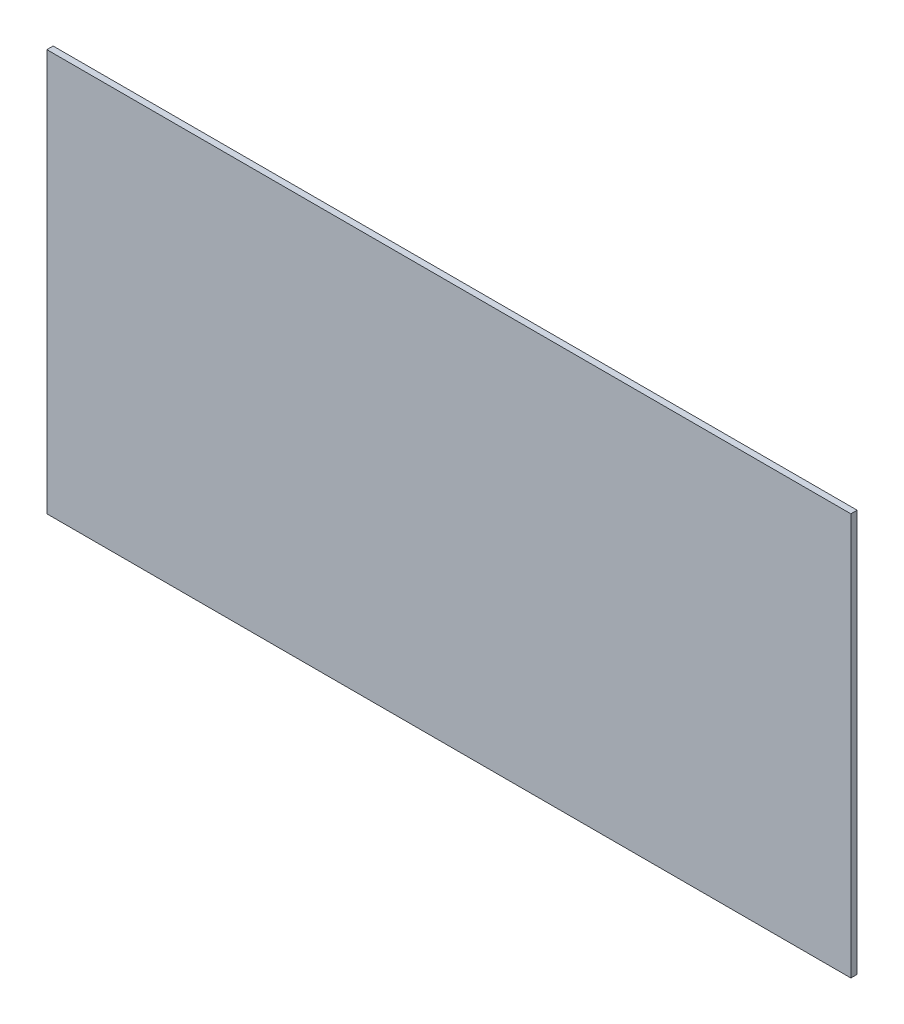
ISO-10303-21;
HEADER;
FILE_DESCRIPTION(('STEP AP214'),'2;1');
FILE_NAME('part.step','',(''),(''),'','','');
FILE_SCHEMA(('AUTOMOTIVE_DESIGN { 1 0 10303 214 1 1 1 1 }'));
ENDSEC;
DATA;
#1=APPLICATION_CONTEXT('core data for automotive mechanical design processes');
#2=APPLICATION_PROTOCOL_DEFINITION('international standard','automotive_design',2000,#1);
#3=PRODUCT_CONTEXT('',#1,'mechanical');
#4=PRODUCT('Part','Part','',(#3));
#5=PRODUCT_RELATED_PRODUCT_CATEGORY('part','',(#4));
#6=PRODUCT_DEFINITION_FORMATION('','',#4);
#7=PRODUCT_DEFINITION_CONTEXT('part definition',#1,'design');
#8=PRODUCT_DEFINITION('design','',#6,#7);
#9=PRODUCT_DEFINITION_SHAPE('','',#8);
#10=(LENGTH_UNIT() NAMED_UNIT(*) SI_UNIT(.MILLI.,.METRE.));
#11=(NAMED_UNIT(*) PLANE_ANGLE_UNIT() SI_UNIT($,.RADIAN.));
#12=(NAMED_UNIT(*) SI_UNIT($,.STERADIAN.) SOLID_ANGLE_UNIT());
#13=UNCERTAINTY_MEASURE_WITH_UNIT(LENGTH_MEASURE(1.E-05),#10,'distance_accuracy_value','');
#14=(GEOMETRIC_REPRESENTATION_CONTEXT(3) GLOBAL_UNCERTAINTY_ASSIGNED_CONTEXT((#13)) GLOBAL_UNIT_ASSIGNED_CONTEXT((#10,
#11,#12)) REPRESENTATION_CONTEXT('',''));
#15=CARTESIAN_POINT('',(0.,0.,0.));
#16=DIRECTION('',(0.,0.,1.));
#17=DIRECTION('',(1.,0.,0.));
#18=AXIS2_PLACEMENT_3D('',#15,#16,#17);
#19=CARTESIAN_POINT('',(-304.8,-152.4,2.38125));
#20=DIRECTION('',(0.,1.,0.));
#21=DIRECTION('',(0.,0.,1.));
#22=AXIS2_PLACEMENT_3D('',#19,#20,#21);
#23=PLANE('',#22);
#24=DIRECTION('',(1.,0.,0.));
#25=VECTOR('',#24,1.);
#26=CARTESIAN_POINT('',(-304.8,-152.4,-2.38125));
#27=LINE('',#26,#25);
#28=CARTESIAN_POINT('',(-304.8,-152.4,-2.38125));
#29=VERTEX_POINT('',#28);
#30=CARTESIAN_POINT('',(304.8,-152.4,-2.38125));
#31=VERTEX_POINT('',#30);
#32=EDGE_CURVE('E109',#29,#31,#27,.T.);
#33=ORIENTED_EDGE('',*,*,#32,.T.);
#34=DIRECTION('',(0.,0.,-1.));
#35=VECTOR('',#34,1.);
#36=CARTESIAN_POINT('',(304.8,-152.4,2.38125));
#37=LINE('',#36,#35);
#38=CARTESIAN_POINT('',(304.8,-152.4,2.38125));
#39=VERTEX_POINT('',#38);
#40=EDGE_CURVE('E11',#39,#31,#37,.T.);
#41=ORIENTED_EDGE('',*,*,#40,.F.);
#42=DIRECTION('',(1.,0.,0.));
#43=VECTOR('',#42,1.);
#44=CARTESIAN_POINT('',(-304.8,-152.4,2.38125));
#45=LINE('',#44,#43);
#46=CARTESIAN_POINT('',(-304.8,-152.4,2.38125));
#47=VERTEX_POINT('',#46);
#48=EDGE_CURVE('E93',#47,#39,#45,.T.);
#49=ORIENTED_EDGE('',*,*,#48,.F.);
#50=DIRECTION('',(0.,0.,-1.));
#51=VECTOR('',#50,1.);
#52=CARTESIAN_POINT('',(-304.8,-152.4,2.38125));
#53=LINE('',#52,#51);
#54=EDGE_CURVE('E105',#47,#29,#53,.T.);
#55=ORIENTED_EDGE('',*,*,#54,.T.);
#56=EDGE_LOOP('',(#33,#41,#49,#55));
#57=FACE_BOUND('',#56,.T.);
#58=ADVANCED_FACE('F41',(#57),#23,.F.);
#59=CARTESIAN_POINT('',(304.8,-152.4,2.38125));
#60=DIRECTION('',(-1.,0.,0.));
#61=DIRECTION('',(0.,0.,1.));
#62=AXIS2_PLACEMENT_3D('',#59,#60,#61);
#63=PLANE('',#62);
#64=DIRECTION('',(0.,1.,0.));
#65=VECTOR('',#64,1.);
#66=CARTESIAN_POINT('',(304.8,-152.4,-2.38125));
#67=LINE('',#66,#65);
#68=CARTESIAN_POINT('',(304.8,152.4,-2.38125));
#69=VERTEX_POINT('',#68);
#70=EDGE_CURVE('E98',#31,#69,#67,.T.);
#71=ORIENTED_EDGE('',*,*,#70,.T.);
#72=DIRECTION('',(0.,0.,-1.));
#73=VECTOR('',#72,1.);
#74=CARTESIAN_POINT('',(304.8,152.4,2.38125));
#75=LINE('',#74,#73);
#76=CARTESIAN_POINT('',(304.8,152.4,2.38125));
#77=VERTEX_POINT('',#76);
#78=EDGE_CURVE('E50',#77,#69,#75,.T.);
#79=ORIENTED_EDGE('',*,*,#78,.F.);
#80=DIRECTION('',(0.,1.,0.));
#81=VECTOR('',#80,1.);
#82=CARTESIAN_POINT('',(304.8,-152.4,2.38125));
#83=LINE('',#82,#81);
#84=EDGE_CURVE('E88',#39,#77,#83,.T.);
#85=ORIENTED_EDGE('',*,*,#84,.F.);
#86=ORIENTED_EDGE('',*,*,#40,.T.);
#87=EDGE_LOOP('',(#71,#79,#85,#86));
#88=FACE_BOUND('',#87,.T.);
#89=ADVANCED_FACE('F97',(#88),#63,.F.);
#90=CARTESIAN_POINT('',(-304.8,152.4,2.38125));
#91=DIRECTION('',(0.,-1.,0.));
#92=DIRECTION('',(0.,0.,-1.));
#93=AXIS2_PLACEMENT_3D('',#90,#91,#92);
#94=PLANE('',#93);
#95=DIRECTION('',(-1.,0.,0.));
#96=VECTOR('',#95,1.);
#97=CARTESIAN_POINT('',(-304.8,152.4,-2.38125));
#98=LINE('',#97,#96);
#99=CARTESIAN_POINT('',(-304.8,152.4,-2.38125));
#100=VERTEX_POINT('',#99);
#101=EDGE_CURVE('E75',#69,#100,#98,.T.);
#102=ORIENTED_EDGE('',*,*,#101,.T.);
#103=DIRECTION('',(0.,0.,-1.));
#104=VECTOR('',#103,1.);
#105=CARTESIAN_POINT('',(-304.8,152.4,2.38125));
#106=LINE('',#105,#104);
#107=CARTESIAN_POINT('',(-304.8,152.4,2.38125));
#108=VERTEX_POINT('',#107);
#109=EDGE_CURVE('E100',#108,#100,#106,.T.);
#110=ORIENTED_EDGE('',*,*,#109,.F.);
#111=DIRECTION('',(-1.,0.,0.));
#112=VECTOR('',#111,1.);
#113=CARTESIAN_POINT('',(-304.8,152.4,2.38125));
#114=LINE('',#113,#112);
#115=EDGE_CURVE('E91',#77,#108,#114,.T.);
#116=ORIENTED_EDGE('',*,*,#115,.F.);
#117=ORIENTED_EDGE('',*,*,#78,.T.);
#118=EDGE_LOOP('',(#102,#110,#116,#117));
#119=FACE_BOUND('',#118,.T.);
#120=ADVANCED_FACE('F101',(#119),#94,.F.);
#121=CARTESIAN_POINT('',(-304.8,-152.4,2.38125));
#122=DIRECTION('',(1.,0.,0.));
#123=DIRECTION('',(0.,0.,-1.));
#124=AXIS2_PLACEMENT_3D('',#121,#122,#123);
#125=PLANE('',#124);
#126=DIRECTION('',(0.,-1.,0.));
#127=VECTOR('',#126,1.);
#128=CARTESIAN_POINT('',(-304.8,-152.4,-2.38125));
#129=LINE('',#128,#127);
#130=EDGE_CURVE('E81',#100,#29,#129,.T.);
#131=ORIENTED_EDGE('',*,*,#130,.T.);
#132=ORIENTED_EDGE('',*,*,#54,.F.);
#133=DIRECTION('',(0.,-1.,0.));
#134=VECTOR('',#133,1.);
#135=CARTESIAN_POINT('',(-304.8,-152.4,2.38125));
#136=LINE('',#135,#134);
#137=EDGE_CURVE('E58',#108,#47,#136,.T.);
#138=ORIENTED_EDGE('',*,*,#137,.F.);
#139=ORIENTED_EDGE('',*,*,#109,.T.);
#140=EDGE_LOOP('',(#131,#132,#138,#139));
#141=FACE_BOUND('',#140,.T.);
#142=ADVANCED_FACE('F122',(#141),#125,.F.);
#143=CARTESIAN_POINT('',(0.,0.,2.38125));
#144=DIRECTION('',(0.,0.,1.));
#145=DIRECTION('',(1.,0.,0.));
#146=AXIS2_PLACEMENT_3D('',#143,#144,#145);
#147=PLANE('',#146);
#148=ORIENTED_EDGE('',*,*,#48,.T.);
#149=ORIENTED_EDGE('',*,*,#84,.T.);
#150=ORIENTED_EDGE('',*,*,#115,.T.);
#151=ORIENTED_EDGE('',*,*,#137,.T.);
#152=EDGE_LOOP('',(#148,#149,#150,#151));
#153=FACE_BOUND('',#152,.T.);
#154=ADVANCED_FACE('F89',(#153),#147,.T.);
#155=CARTESIAN_POINT('',(0.,0.,-2.38125));
#156=DIRECTION('',(0.,0.,1.));
#157=DIRECTION('',(1.,0.,0.));
#158=AXIS2_PLACEMENT_3D('',#155,#156,#157);
#159=PLANE('',#158);
#160=ORIENTED_EDGE('',*,*,#32,.F.);
#161=ORIENTED_EDGE('',*,*,#130,.F.);
#162=ORIENTED_EDGE('',*,*,#101,.F.);
#163=ORIENTED_EDGE('',*,*,#70,.F.);
#164=EDGE_LOOP('',(#160,#161,#162,#163));
#165=FACE_BOUND('',#164,.T.);
#166=ADVANCED_FACE('F125',(#165),#159,.F.);
#167=CLOSED_SHELL('',(#58,#89,#120,#142,#154,#166));
#168=MANIFOLD_SOLID_BREP('B2',#167);
#169=ADVANCED_BREP_SHAPE_REPRESENTATION('',(#18,#168),#14);
#170=SHAPE_DEFINITION_REPRESENTATION(#9,#169);
ENDSEC;
END-ISO-10303-21;
